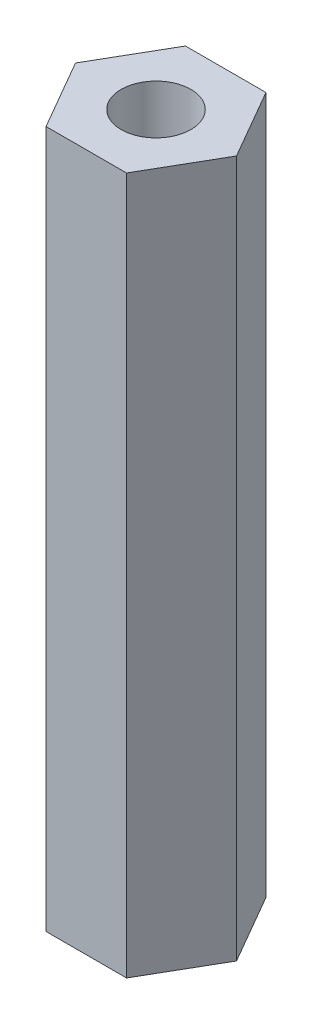
ISO-10303-21;
HEADER;
FILE_DESCRIPTION(('STEP AP214'),'2;1');
FILE_NAME('part.step','',(''),(''),'','','');
FILE_SCHEMA(('AUTOMOTIVE_DESIGN { 1 0 10303 214 1 1 1 1 }'));
ENDSEC;
DATA;
#1=APPLICATION_CONTEXT('core data for automotive mechanical design processes');
#2=APPLICATION_PROTOCOL_DEFINITION('international standard','automotive_design',2000,#1);
#3=PRODUCT_CONTEXT('',#1,'mechanical');
#4=PRODUCT('Part','Part','',(#3));
#5=PRODUCT_RELATED_PRODUCT_CATEGORY('part','',(#4));
#6=PRODUCT_DEFINITION_FORMATION('','',#4);
#7=PRODUCT_DEFINITION_CONTEXT('part definition',#1,'design');
#8=PRODUCT_DEFINITION('design','',#6,#7);
#9=PRODUCT_DEFINITION_SHAPE('','',#8);
#10=(LENGTH_UNIT() NAMED_UNIT(*) SI_UNIT(.MILLI.,.METRE.));
#11=(NAMED_UNIT(*) PLANE_ANGLE_UNIT() SI_UNIT($,.RADIAN.));
#12=(NAMED_UNIT(*) SI_UNIT($,.STERADIAN.) SOLID_ANGLE_UNIT());
#13=UNCERTAINTY_MEASURE_WITH_UNIT(LENGTH_MEASURE(1.E-05),#10,'distance_accuracy_value','');
#14=(GEOMETRIC_REPRESENTATION_CONTEXT(3) GLOBAL_UNCERTAINTY_ASSIGNED_CONTEXT((#13)) GLOBAL_UNIT_ASSIGNED_CONTEXT((#10,
#11,#12)) REPRESENTATION_CONTEXT('',''));
#15=CARTESIAN_POINT('',(0.,0.,0.));
#16=DIRECTION('',(0.,0.,1.));
#17=DIRECTION('',(1.,0.,0.));
#18=AXIS2_PLACEMENT_3D('',#15,#16,#17);
#19=CARTESIAN_POINT('',(0.,10.,0.));
#20=DIRECTION('',(0.,1.,0.));
#21=DIRECTION('',(0.,0.,1.));
#22=AXIS2_PLACEMENT_3D('',#19,#20,#21);
#23=PLANE('',#22);
#24=DIRECTION('',(0.5,0.,-0.866025403784439));
#25=VECTOR('',#24,1.);
#26=CARTESIAN_POINT('',(1.15470053837925,10.,2.));
#27=LINE('',#26,#25);
#28=CARTESIAN_POINT('',(1.15470053837925,10.,2.));
#29=VERTEX_POINT('',#28);
#30=CARTESIAN_POINT('',(2.3094010767585,10.,0.));
#31=VERTEX_POINT('',#30);
#32=EDGE_CURVE('E130',#29,#31,#27,.T.);
#33=ORIENTED_EDGE('',*,*,#32,.T.);
#34=DIRECTION('',(-0.5,0.,-0.866025403784439));
#35=VECTOR('',#34,1.);
#36=CARTESIAN_POINT('',(2.3094010767585,10.,0.));
#37=LINE('',#36,#35);
#38=CARTESIAN_POINT('',(1.15470053837925,10.,-2.));
#39=VERTEX_POINT('',#38);
#40=EDGE_CURVE('E88',#31,#39,#37,.T.);
#41=ORIENTED_EDGE('',*,*,#40,.T.);
#42=DIRECTION('',(-1.,0.,0.));
#43=VECTOR('',#42,1.);
#44=CARTESIAN_POINT('',(1.15470053837925,10.,-2.));
#45=LINE('',#44,#43);
#46=CARTESIAN_POINT('',(-1.15470053837925,10.,-2.));
#47=VERTEX_POINT('',#46);
#48=EDGE_CURVE('E101',#39,#47,#45,.T.);
#49=ORIENTED_EDGE('',*,*,#48,.T.);
#50=DIRECTION('',(-0.5,0.,0.866025403784439));
#51=VECTOR('',#50,1.);
#52=CARTESIAN_POINT('',(-1.15470053837925,10.,-2.));
#53=LINE('',#52,#51);
#54=CARTESIAN_POINT('',(-2.3094010767585,10.,0.));
#55=VERTEX_POINT('',#54);
#56=EDGE_CURVE('E95',#47,#55,#53,.T.);
#57=ORIENTED_EDGE('',*,*,#56,.T.);
#58=DIRECTION('',(0.5,0.,0.866025403784438));
#59=VECTOR('',#58,1.);
#60=CARTESIAN_POINT('',(-2.3094010767585,10.,0.));
#61=LINE('',#60,#59);
#62=CARTESIAN_POINT('',(-1.15470053837925,10.,2.));
#63=VERTEX_POINT('',#62);
#64=EDGE_CURVE('E99',#55,#63,#61,.T.);
#65=ORIENTED_EDGE('',*,*,#64,.T.);
#66=DIRECTION('',(1.,0.,0.));
#67=VECTOR('',#66,1.);
#68=CARTESIAN_POINT('',(-1.15470053837925,10.,2.));
#69=LINE('',#68,#67);
#70=EDGE_CURVE('E51',#63,#29,#69,.T.);
#71=ORIENTED_EDGE('',*,*,#70,.T.);
#72=EDGE_LOOP('',(#33,#41,#49,#57,#65,#71));
#73=FACE_BOUND('',#72,.T.);
#74=CARTESIAN_POINT('',(0.,10.,0.));
#75=DIRECTION('',(0.,1.,0.));
#76=DIRECTION('',(0.,0.,1.));
#77=AXIS2_PLACEMENT_3D('',#74,#75,#76);
#78=CIRCLE('',#77,1.);
#79=CARTESIAN_POINT('',(0.,10.,1.));
#80=VERTEX_POINT('',#79);
#81=EDGE_CURVE('E123',#80,#80,#78,.T.);
#82=ORIENTED_EDGE('',*,*,#81,.F.);
#83=EDGE_LOOP('',(#82));
#84=FACE_BOUND('',#83,.T.);
#85=ADVANCED_FACE('F34',(#73,#84),#23,.T.);
#86=CARTESIAN_POINT('',(0.,-10.,0.));
#87=DIRECTION('',(0.,1.,0.));
#88=DIRECTION('',(0.,0.,1.));
#89=AXIS2_PLACEMENT_3D('',#86,#87,#88);
#90=PLANE('',#89);
#91=DIRECTION('',(0.5,0.,-0.866025403784439));
#92=VECTOR('',#91,1.);
#93=CARTESIAN_POINT('',(1.15470053837925,-10.,2.));
#94=LINE('',#93,#92);
#95=CARTESIAN_POINT('',(1.15470053837925,-10.,2.));
#96=VERTEX_POINT('',#95);
#97=CARTESIAN_POINT('',(2.3094010767585,-10.,0.));
#98=VERTEX_POINT('',#97);
#99=EDGE_CURVE('E119',#96,#98,#94,.T.);
#100=ORIENTED_EDGE('',*,*,#99,.F.);
#101=DIRECTION('',(1.,0.,0.));
#102=VECTOR('',#101,1.);
#103=CARTESIAN_POINT('',(-1.15470053837925,-10.,2.));
#104=LINE('',#103,#102);
#105=CARTESIAN_POINT('',(-1.15470053837925,-10.,2.));
#106=VERTEX_POINT('',#105);
#107=EDGE_CURVE('E80',#106,#96,#104,.T.);
#108=ORIENTED_EDGE('',*,*,#107,.F.);
#109=DIRECTION('',(0.5,0.,0.866025403784438));
#110=VECTOR('',#109,1.);
#111=CARTESIAN_POINT('',(-2.3094010767585,-10.,0.));
#112=LINE('',#111,#110);
#113=CARTESIAN_POINT('',(-2.3094010767585,-10.,0.));
#114=VERTEX_POINT('',#113);
#115=EDGE_CURVE('E74',#114,#106,#112,.T.);
#116=ORIENTED_EDGE('',*,*,#115,.F.);
#117=DIRECTION('',(-0.5,0.,0.866025403784439));
#118=VECTOR('',#117,1.);
#119=CARTESIAN_POINT('',(-1.15470053837925,-10.,-2.));
#120=LINE('',#119,#118);
#121=CARTESIAN_POINT('',(-1.15470053837925,-10.,-2.));
#122=VERTEX_POINT('',#121);
#123=EDGE_CURVE('E109',#122,#114,#120,.T.);
#124=ORIENTED_EDGE('',*,*,#123,.F.);
#125=DIRECTION('',(-1.,0.,0.));
#126=VECTOR('',#125,1.);
#127=CARTESIAN_POINT('',(1.15470053837925,-10.,-2.));
#128=LINE('',#127,#126);
#129=CARTESIAN_POINT('',(1.15470053837925,-10.,-2.));
#130=VERTEX_POINT('',#129);
#131=EDGE_CURVE('E125',#130,#122,#128,.T.);
#132=ORIENTED_EDGE('',*,*,#131,.F.);
#133=DIRECTION('',(-0.5,0.,-0.866025403784439));
#134=VECTOR('',#133,1.);
#135=CARTESIAN_POINT('',(2.3094010767585,-10.,0.));
#136=LINE('',#135,#134);
#137=EDGE_CURVE('E122',#98,#130,#136,.T.);
#138=ORIENTED_EDGE('',*,*,#137,.F.);
#139=EDGE_LOOP('',(#100,#108,#116,#124,#132,#138));
#140=FACE_BOUND('',#139,.T.);
#141=CARTESIAN_POINT('',(0.,-10.,0.));
#142=DIRECTION('',(0.,1.,0.));
#143=DIRECTION('',(0.,0.,1.));
#144=AXIS2_PLACEMENT_3D('',#141,#142,#143);
#145=CIRCLE('',#144,1.);
#146=CARTESIAN_POINT('',(0.,-10.,1.));
#147=VERTEX_POINT('',#146);
#148=EDGE_CURVE('E223',#147,#147,#145,.T.);
#149=ORIENTED_EDGE('',*,*,#148,.T.);
#150=EDGE_LOOP('',(#149));
#151=FACE_BOUND('',#150,.T.);
#152=ADVANCED_FACE('F139',(#140,#151),#90,.F.);
#153=CARTESIAN_POINT('',(1.15470053837925,10.,2.));
#154=DIRECTION('',(-0.866025403784439,0.,-0.5));
#155=DIRECTION('',(-0.5,0.,0.866025403784439));
#156=AXIS2_PLACEMENT_3D('',#153,#154,#155);
#157=PLANE('',#156);
#158=ORIENTED_EDGE('',*,*,#99,.T.);
#159=DIRECTION('',(0.,-1.,0.));
#160=VECTOR('',#159,1.);
#161=CARTESIAN_POINT('',(2.3094010767585,10.,0.));
#162=LINE('',#161,#160);
#163=EDGE_CURVE('E11',#31,#98,#162,.T.);
#164=ORIENTED_EDGE('',*,*,#163,.F.);
#165=ORIENTED_EDGE('',*,*,#32,.F.);
#166=DIRECTION('',(0.,-1.,0.));
#167=VECTOR('',#166,1.);
#168=CARTESIAN_POINT('',(1.15470053837925,10.,2.));
#169=LINE('',#168,#167);
#170=EDGE_CURVE('E115',#29,#96,#169,.T.);
#171=ORIENTED_EDGE('',*,*,#170,.T.);
#172=EDGE_LOOP('',(#158,#164,#165,#171));
#173=FACE_BOUND('',#172,.T.);
#174=ADVANCED_FACE('F36',(#173),#157,.F.);
#175=CARTESIAN_POINT('',(2.3094010767585,10.,0.));
#176=DIRECTION('',(-0.866025403784438,0.,0.5));
#177=DIRECTION('',(0.5,0.,0.866025403784439));
#178=AXIS2_PLACEMENT_3D('',#175,#176,#177);
#179=PLANE('',#178);
#180=ORIENTED_EDGE('',*,*,#137,.T.);
#181=DIRECTION('',(0.,-1.,0.));
#182=VECTOR('',#181,1.);
#183=CARTESIAN_POINT('',(1.15470053837925,10.,-2.));
#184=LINE('',#183,#182);
#185=EDGE_CURVE('E43',#39,#130,#184,.T.);
#186=ORIENTED_EDGE('',*,*,#185,.F.);
#187=ORIENTED_EDGE('',*,*,#40,.F.);
#188=ORIENTED_EDGE('',*,*,#163,.T.);
#189=EDGE_LOOP('',(#180,#186,#187,#188));
#190=FACE_BOUND('',#189,.T.);
#191=ADVANCED_FACE('F164',(#190),#179,.F.);
#192=CARTESIAN_POINT('',(1.15470053837925,10.,-2.));
#193=DIRECTION('',(0.,0.,1.));
#194=DIRECTION('',(1.,0.,0.));
#195=AXIS2_PLACEMENT_3D('',#192,#193,#194);
#196=PLANE('',#195);
#197=ORIENTED_EDGE('',*,*,#131,.T.);
#198=DIRECTION('',(0.,-1.,0.));
#199=VECTOR('',#198,1.);
#200=CARTESIAN_POINT('',(-1.15470053837925,10.,-2.));
#201=LINE('',#200,#199);
#202=EDGE_CURVE('E110',#47,#122,#201,.T.);
#203=ORIENTED_EDGE('',*,*,#202,.F.);
#204=ORIENTED_EDGE('',*,*,#48,.F.);
#205=ORIENTED_EDGE('',*,*,#185,.T.);
#206=EDGE_LOOP('',(#197,#203,#204,#205));
#207=FACE_BOUND('',#206,.T.);
#208=ADVANCED_FACE('F136',(#207),#196,.F.);
#209=CARTESIAN_POINT('',(-1.15470053837925,10.,-2.));
#210=DIRECTION('',(0.866025403784439,0.,0.5));
#211=DIRECTION('',(0.5,0.,-0.866025403784439));
#212=AXIS2_PLACEMENT_3D('',#209,#210,#211);
#213=PLANE('',#212);
#214=ORIENTED_EDGE('',*,*,#123,.T.);
#215=DIRECTION('',(0.,-1.,0.));
#216=VECTOR('',#215,1.);
#217=CARTESIAN_POINT('',(-2.3094010767585,10.,0.));
#218=LINE('',#217,#216);
#219=EDGE_CURVE('E106',#55,#114,#218,.T.);
#220=ORIENTED_EDGE('',*,*,#219,.F.);
#221=ORIENTED_EDGE('',*,*,#56,.F.);
#222=ORIENTED_EDGE('',*,*,#202,.T.);
#223=EDGE_LOOP('',(#214,#220,#221,#222));
#224=FACE_BOUND('',#223,.T.);
#225=ADVANCED_FACE('F107',(#224),#213,.F.);
#226=CARTESIAN_POINT('',(-2.3094010767585,10.,0.));
#227=DIRECTION('',(0.866025403784438,0.,-0.5));
#228=DIRECTION('',(-0.5,0.,-0.866025403784439));
#229=AXIS2_PLACEMENT_3D('',#226,#227,#228);
#230=PLANE('',#229);
#231=ORIENTED_EDGE('',*,*,#115,.T.);
#232=DIRECTION('',(0.,-1.,0.));
#233=VECTOR('',#232,1.);
#234=CARTESIAN_POINT('',(-1.15470053837925,10.,2.));
#235=LINE('',#234,#233);
#236=EDGE_CURVE('E111',#63,#106,#235,.T.);
#237=ORIENTED_EDGE('',*,*,#236,.F.);
#238=ORIENTED_EDGE('',*,*,#64,.F.);
#239=ORIENTED_EDGE('',*,*,#219,.T.);
#240=EDGE_LOOP('',(#231,#237,#238,#239));
#241=FACE_BOUND('',#240,.T.);
#242=ADVANCED_FACE('F113',(#241),#230,.F.);
#243=CARTESIAN_POINT('',(-1.15470053837925,10.,2.));
#244=DIRECTION('',(0.,0.,-1.));
#245=DIRECTION('',(-1.,0.,0.));
#246=AXIS2_PLACEMENT_3D('',#243,#244,#245);
#247=PLANE('',#246);
#248=ORIENTED_EDGE('',*,*,#107,.T.);
#249=ORIENTED_EDGE('',*,*,#170,.F.);
#250=ORIENTED_EDGE('',*,*,#70,.F.);
#251=ORIENTED_EDGE('',*,*,#236,.T.);
#252=EDGE_LOOP('',(#248,#249,#250,#251));
#253=FACE_BOUND('',#252,.T.);
#254=ADVANCED_FACE('F144',(#253),#247,.F.);
#255=CARTESIAN_POINT('',(0.,10.,0.));
#256=DIRECTION('',(0.,-1.,0.));
#257=DIRECTION('',(0.,0.,-1.));
#258=AXIS2_PLACEMENT_3D('',#255,#256,#257);
#259=CYLINDRICAL_SURFACE('',#258,1.);
#260=ORIENTED_EDGE('',*,*,#81,.T.);
#261=EDGE_LOOP('',(#260));
#262=FACE_BOUND('',#261,.T.);
#263=ORIENTED_EDGE('',*,*,#148,.F.);
#264=EDGE_LOOP('',(#263));
#265=FACE_BOUND('',#264,.T.);
#266=ADVANCED_FACE('F146',(#262,#265),#259,.F.);
#267=CLOSED_SHELL('',(#85,#152,#174,#191,#208,#225,#242,#254,#266));
#268=MANIFOLD_SOLID_BREP('B2',#267);
#269=ADVANCED_BREP_SHAPE_REPRESENTATION('',(#18,#268),#14);
#270=SHAPE_DEFINITION_REPRESENTATION(#9,#269);
ENDSEC;
END-ISO-10303-21;
